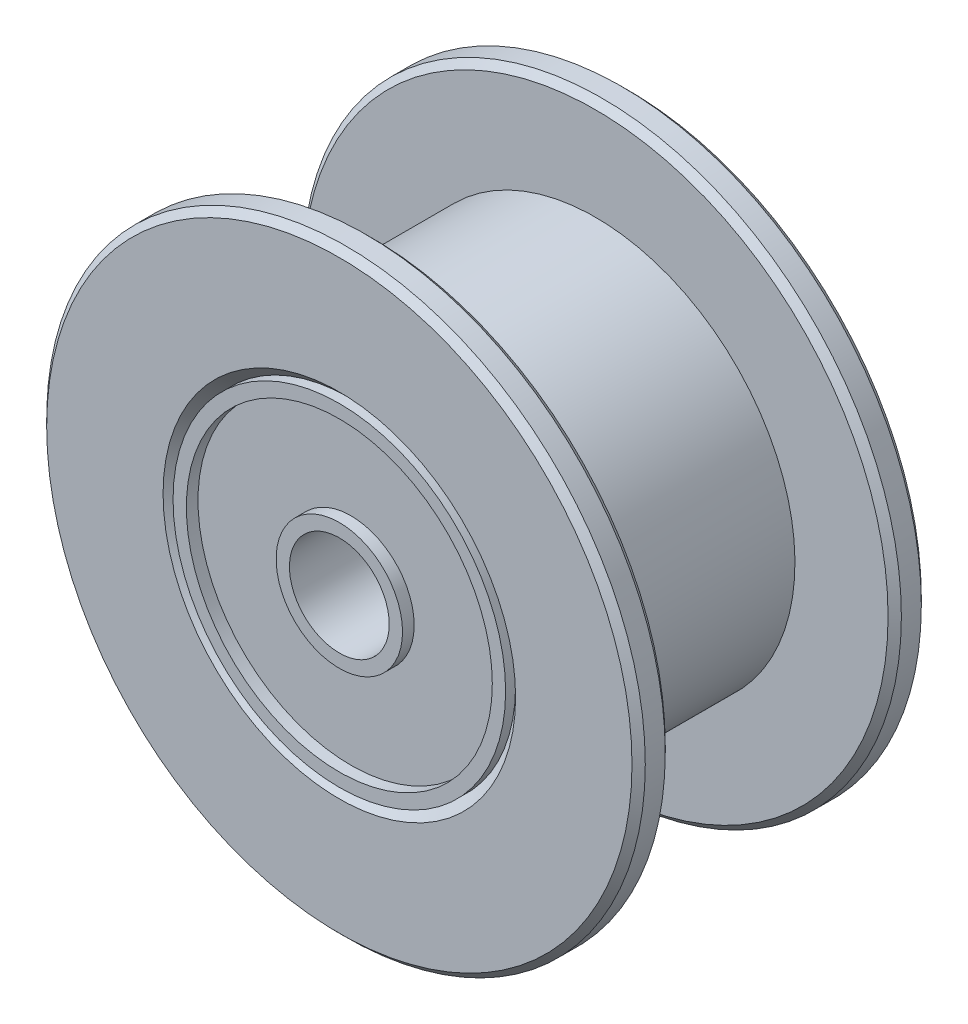
ISO-10303-21;
HEADER;
FILE_DESCRIPTION(('STEP AP214'),'2;1');
FILE_NAME('part.step','',(''),(''),'','','');
FILE_SCHEMA(('AUTOMOTIVE_DESIGN { 1 0 10303 214 1 1 1 1 }'));
ENDSEC;
DATA;
#1=APPLICATION_CONTEXT('core data for automotive mechanical design processes');
#2=APPLICATION_PROTOCOL_DEFINITION('international standard','automotive_design',2000,#1);
#3=PRODUCT_CONTEXT('',#1,'mechanical');
#4=PRODUCT('Part','Part','',(#3));
#5=PRODUCT_RELATED_PRODUCT_CATEGORY('part','',(#4));
#6=PRODUCT_DEFINITION_FORMATION('','',#4);
#7=PRODUCT_DEFINITION_CONTEXT('part definition',#1,'design');
#8=PRODUCT_DEFINITION('design','',#6,#7);
#9=PRODUCT_DEFINITION_SHAPE('','',#8);
#10=(LENGTH_UNIT() NAMED_UNIT(*) SI_UNIT(.MILLI.,.METRE.));
#11=(NAMED_UNIT(*) PLANE_ANGLE_UNIT() SI_UNIT($,.RADIAN.));
#12=(NAMED_UNIT(*) SI_UNIT($,.STERADIAN.) SOLID_ANGLE_UNIT());
#13=UNCERTAINTY_MEASURE_WITH_UNIT(LENGTH_MEASURE(1.E-05),#10,'distance_accuracy_value','');
#14=(GEOMETRIC_REPRESENTATION_CONTEXT(3) GLOBAL_UNCERTAINTY_ASSIGNED_CONTEXT((#13)) GLOBAL_UNIT_ASSIGNED_CONTEXT((#10,
#11,#12)) REPRESENTATION_CONTEXT('',''));
#15=CARTESIAN_POINT('',(0.,0.,0.));
#16=DIRECTION('',(0.,0.,1.));
#17=DIRECTION('',(1.,0.,0.));
#18=AXIS2_PLACEMENT_3D('',#15,#16,#17);
#19=CARTESIAN_POINT('',(0.,0.,4.2));
#20=DIRECTION('',(0.,0.,1.));
#21=DIRECTION('',(-1.,0.,0.));
#22=AXIS2_PLACEMENT_3D('',#19,#20,#21);
#23=CONICAL_SURFACE('',#22,5.15,0.785398163397449);
#24=CARTESIAN_POINT('',(0.,0.,4.35));
#25=DIRECTION('',(0.,0.,1.));
#26=DIRECTION('',(-1.,0.,0.));
#27=AXIS2_PLACEMENT_3D('',#24,#25,#26);
#28=CIRCLE('',#27,5.3);
#29=CARTESIAN_POINT('',(5.3,0.,4.35));
#30=VERTEX_POINT('',#29);
#31=EDGE_CURVE('E155',#30,#30,#28,.T.);
#32=ORIENTED_EDGE('',*,*,#31,.T.);
#33=EDGE_LOOP('',(#32));
#34=FACE_BOUND('',#33,.T.);
#35=CARTESIAN_POINT('',(0.,0.,4.05));
#36=DIRECTION('',(0.,0.,-1.));
#37=DIRECTION('',(-1.,0.,0.));
#38=AXIS2_PLACEMENT_3D('',#35,#36,#37);
#39=CIRCLE('',#38,5.);
#40=CARTESIAN_POINT('',(5.,0.,4.05));
#41=VERTEX_POINT('',#40);
#42=EDGE_CURVE('E126',#41,#41,#39,.T.);
#43=ORIENTED_EDGE('',*,*,#42,.T.);
#44=EDGE_LOOP('',(#43));
#45=FACE_BOUND('',#44,.T.);
#46=ADVANCED_FACE('F16',(#34,#45),#23,.F.);
#47=CARTESIAN_POINT('',(0.,0.,-4.2));
#48=DIRECTION('',(0.,0.,-1.));
#49=DIRECTION('',(-1.,0.,0.));
#50=AXIS2_PLACEMENT_3D('',#47,#48,#49);
#51=CONICAL_SURFACE('',#50,5.15,0.785398163397449);
#52=CARTESIAN_POINT('',(0.,0.,-4.35));
#53=DIRECTION('',(0.,0.,-1.));
#54=DIRECTION('',(-1.,0.,0.));
#55=AXIS2_PLACEMENT_3D('',#52,#53,#54);
#56=CIRCLE('',#55,5.3);
#57=CARTESIAN_POINT('',(5.3,0.,-4.35));
#58=VERTEX_POINT('',#57);
#59=EDGE_CURVE('E146',#58,#58,#56,.T.);
#60=ORIENTED_EDGE('',*,*,#59,.T.);
#61=EDGE_LOOP('',(#60));
#62=FACE_BOUND('',#61,.T.);
#63=CARTESIAN_POINT('',(0.,0.,-4.05));
#64=DIRECTION('',(0.,0.,1.));
#65=DIRECTION('',(-1.,0.,0.));
#66=AXIS2_PLACEMENT_3D('',#63,#64,#65);
#67=CIRCLE('',#66,5.);
#68=CARTESIAN_POINT('',(5.,0.,-4.05));
#69=VERTEX_POINT('',#68);
#70=EDGE_CURVE('E26',#69,#69,#67,.T.);
#71=ORIENTED_EDGE('',*,*,#70,.T.);
#72=EDGE_LOOP('',(#71));
#73=FACE_BOUND('',#72,.T.);
#74=ADVANCED_FACE('F189',(#62,#73),#51,.F.);
#75=CARTESIAN_POINT('',(0.,0.,4.35));
#76=DIRECTION('',(0.,0.,1.));
#77=DIRECTION('',(1.,0.,0.));
#78=AXIS2_PLACEMENT_3D('',#75,#76,#77);
#79=PLANE('',#78);
#80=CARTESIAN_POINT('',(0.,0.,4.35));
#81=DIRECTION('',(0.,0.,1.));
#82=DIRECTION('',(-1.,0.,0.));
#83=AXIS2_PLACEMENT_3D('',#80,#81,#82);
#84=CIRCLE('',#83,5.);
#85=CARTESIAN_POINT('',(5.,0.,4.35));
#86=VERTEX_POINT('',#85);
#87=EDGE_CURVE('E134',#86,#86,#84,.T.);
#88=ORIENTED_EDGE('',*,*,#87,.T.);
#89=EDGE_LOOP('',(#88));
#90=FACE_BOUND('',#89,.T.);
#91=CARTESIAN_POINT('',(0.,0.,4.35));
#92=DIRECTION('',(0.,0.,-1.));
#93=DIRECTION('',(-1.,0.,0.));
#94=AXIS2_PLACEMENT_3D('',#91,#92,#93);
#95=CIRCLE('',#94,4.6);
#96=CARTESIAN_POINT('',(4.6,0.,4.35));
#97=VERTEX_POINT('',#96);
#98=EDGE_CURVE('E20',#97,#97,#95,.T.);
#99=ORIENTED_EDGE('',*,*,#98,.T.);
#100=EDGE_LOOP('',(#99));
#101=FACE_BOUND('',#100,.T.);
#102=ADVANCED_FACE('F194',(#90,#101),#79,.T.);
#103=CARTESIAN_POINT('',(0.,0.,-4.35));
#104=DIRECTION('',(0.,0.,1.));
#105=DIRECTION('',(1.,0.,0.));
#106=AXIS2_PLACEMENT_3D('',#103,#104,#105);
#107=PLANE('',#106);
#108=CARTESIAN_POINT('',(0.,0.,-4.35));
#109=DIRECTION('',(0.,0.,-1.));
#110=DIRECTION('',(-1.,0.,0.));
#111=AXIS2_PLACEMENT_3D('',#108,#109,#110);
#112=CIRCLE('',#111,5.);
#113=CARTESIAN_POINT('',(5.,0.,-4.35));
#114=VERTEX_POINT('',#113);
#115=EDGE_CURVE('E124',#114,#114,#112,.T.);
#116=ORIENTED_EDGE('',*,*,#115,.T.);
#117=EDGE_LOOP('',(#116));
#118=FACE_BOUND('',#117,.T.);
#119=CARTESIAN_POINT('',(0.,0.,-4.35));
#120=DIRECTION('',(0.,0.,1.));
#121=DIRECTION('',(-1.,0.,0.));
#122=AXIS2_PLACEMENT_3D('',#119,#120,#121);
#123=CIRCLE('',#122,4.6);
#124=CARTESIAN_POINT('',(4.6,0.,-4.35));
#125=VERTEX_POINT('',#124);
#126=EDGE_CURVE('E11',#125,#125,#123,.T.);
#127=ORIENTED_EDGE('',*,*,#126,.T.);
#128=EDGE_LOOP('',(#127));
#129=FACE_BOUND('',#128,.T.);
#130=ADVANCED_FACE('F237',(#118,#129),#107,.F.);
#131=CARTESIAN_POINT('',(0.,0.,0.));
#132=DIRECTION('',(0.,0.,-1.));
#133=DIRECTION('',(-1.,0.,0.));
#134=AXIS2_PLACEMENT_3D('',#131,#132,#133);
#135=CYLINDRICAL_SURFACE('',#134,4.6);
#136=ORIENTED_EDGE('',*,*,#126,.F.);
#137=EDGE_LOOP('',(#136));
#138=FACE_BOUND('',#137,.T.);
#139=CARTESIAN_POINT('',(0.,0.,-4.));
#140=DIRECTION('',(0.,0.,1.));
#141=DIRECTION('',(-1.,0.,0.));
#142=AXIS2_PLACEMENT_3D('',#139,#140,#141);
#143=CIRCLE('',#142,4.6);
#144=CARTESIAN_POINT('',(4.6,0.,-4.));
#145=VERTEX_POINT('',#144);
#146=EDGE_CURVE('E112',#145,#145,#143,.T.);
#147=ORIENTED_EDGE('',*,*,#146,.T.);
#148=EDGE_LOOP('',(#147));
#149=FACE_BOUND('',#148,.T.);
#150=ADVANCED_FACE('F232',(#138,#149),#135,.F.);
#151=CARTESIAN_POINT('',(0.,0.,0.));
#152=DIRECTION('',(0.,0.,-1.));
#153=DIRECTION('',(-1.,0.,0.));
#154=AXIS2_PLACEMENT_3D('',#151,#152,#153);
#155=CYLINDRICAL_SURFACE('',#154,5.);
#156=ORIENTED_EDGE('',*,*,#70,.F.);
#157=EDGE_LOOP('',(#156));
#158=FACE_BOUND('',#157,.T.);
#159=ORIENTED_EDGE('',*,*,#115,.F.);
#160=EDGE_LOOP('',(#159));
#161=FACE_BOUND('',#160,.T.);
#162=ADVANCED_FACE('F228',(#158,#161),#155,.T.);
#163=CARTESIAN_POINT('',(0.,0.,0.));
#164=DIRECTION('',(0.,0.,-1.));
#165=DIRECTION('',(-1.,0.,0.));
#166=AXIS2_PLACEMENT_3D('',#163,#164,#165);
#167=CYLINDRICAL_SURFACE('',#166,5.);
#168=ORIENTED_EDGE('',*,*,#42,.F.);
#169=EDGE_LOOP('',(#168));
#170=FACE_BOUND('',#169,.T.);
#171=ORIENTED_EDGE('',*,*,#87,.F.);
#172=EDGE_LOOP('',(#171));
#173=FACE_BOUND('',#172,.T.);
#174=ADVANCED_FACE('F231',(#170,#173),#167,.T.);
#175=CARTESIAN_POINT('',(0.,0.,0.));
#176=DIRECTION('',(0.,0.,-1.));
#177=DIRECTION('',(-1.,0.,0.));
#178=AXIS2_PLACEMENT_3D('',#175,#176,#177);
#179=CYLINDRICAL_SURFACE('',#178,4.6);
#180=CARTESIAN_POINT('',(0.,0.,4.));
#181=DIRECTION('',(0.,0.,-1.));
#182=DIRECTION('',(-1.,0.,0.));
#183=AXIS2_PLACEMENT_3D('',#180,#181,#182);
#184=CIRCLE('',#183,4.6);
#185=CARTESIAN_POINT('',(4.6,0.,4.));
#186=VERTEX_POINT('',#185);
#187=EDGE_CURVE('E104',#186,#186,#184,.T.);
#188=ORIENTED_EDGE('',*,*,#187,.T.);
#189=EDGE_LOOP('',(#188));
#190=FACE_BOUND('',#189,.T.);
#191=ORIENTED_EDGE('',*,*,#98,.F.);
#192=EDGE_LOOP('',(#191));
#193=FACE_BOUND('',#192,.T.);
#194=ADVANCED_FACE('F245',(#190,#193),#179,.F.);
#195=CARTESIAN_POINT('',(0.,0.,4.35));
#196=DIRECTION('',(0.,0.,1.));
#197=DIRECTION('',(1.,0.,0.));
#198=AXIS2_PLACEMENT_3D('',#195,#196,#197);
#199=PLANE('',#198);
#200=CARTESIAN_POINT('',(0.,0.,4.35));
#201=DIRECTION('',(0.,0.,1.));
#202=DIRECTION('',(-1.,0.,0.));
#203=AXIS2_PLACEMENT_3D('',#200,#201,#202);
#204=CIRCLE('',#203,1.9);
#205=CARTESIAN_POINT('',(1.9,0.,4.35));
#206=VERTEX_POINT('',#205);
#207=EDGE_CURVE('E114',#206,#206,#204,.T.);
#208=ORIENTED_EDGE('',*,*,#207,.T.);
#209=EDGE_LOOP('',(#208));
#210=FACE_BOUND('',#209,.T.);
#211=CARTESIAN_POINT('',(0.,0.,4.35));
#212=DIRECTION('',(0.,0.,-1.));
#213=DIRECTION('',(-1.,0.,0.));
#214=AXIS2_PLACEMENT_3D('',#211,#212,#213);
#215=CIRCLE('',#214,1.5);
#216=CARTESIAN_POINT('',(1.5,0.,4.35));
#217=VERTEX_POINT('',#216);
#218=EDGE_CURVE('E123',#217,#217,#215,.T.);
#219=ORIENTED_EDGE('',*,*,#218,.T.);
#220=EDGE_LOOP('',(#219));
#221=FACE_BOUND('',#220,.T.);
#222=ADVANCED_FACE('F203',(#210,#221),#199,.T.);
#223=CARTESIAN_POINT('',(0.,0.,0.));
#224=DIRECTION('',(0.,0.,-1.));
#225=DIRECTION('',(-1.,0.,0.));
#226=AXIS2_PLACEMENT_3D('',#223,#224,#225);
#227=CYLINDRICAL_SURFACE('',#226,1.9);
#228=CARTESIAN_POINT('',(0.,0.,-4.35));
#229=DIRECTION('',(0.,0.,-1.));
#230=DIRECTION('',(-1.,0.,0.));
#231=AXIS2_PLACEMENT_3D('',#228,#229,#230);
#232=CIRCLE('',#231,1.9);
#233=CARTESIAN_POINT('',(1.9,0.,-4.35));
#234=VERTEX_POINT('',#233);
#235=EDGE_CURVE('E159',#234,#234,#232,.T.);
#236=ORIENTED_EDGE('',*,*,#235,.F.);
#237=EDGE_LOOP('',(#236));
#238=FACE_BOUND('',#237,.T.);
#239=CARTESIAN_POINT('',(0.,0.,-4.));
#240=DIRECTION('',(0.,0.,-1.));
#241=DIRECTION('',(-1.,0.,0.));
#242=AXIS2_PLACEMENT_3D('',#239,#240,#241);
#243=CIRCLE('',#242,1.9);
#244=CARTESIAN_POINT('',(1.9,0.,-4.));
#245=VERTEX_POINT('',#244);
#246=EDGE_CURVE('E116',#245,#245,#243,.T.);
#247=ORIENTED_EDGE('',*,*,#246,.T.);
#248=EDGE_LOOP('',(#247));
#249=FACE_BOUND('',#248,.T.);
#250=ADVANCED_FACE('F200',(#238,#249),#227,.T.);
#251=CARTESIAN_POINT('',(0.,0.,-4.35));
#252=DIRECTION('',(0.,0.,1.));
#253=DIRECTION('',(1.,0.,0.));
#254=AXIS2_PLACEMENT_3D('',#251,#252,#253);
#255=PLANE('',#254);
#256=ORIENTED_EDGE('',*,*,#235,.T.);
#257=EDGE_LOOP('',(#256));
#258=FACE_BOUND('',#257,.T.);
#259=CARTESIAN_POINT('',(0.,0.,-4.35));
#260=DIRECTION('',(0.,0.,1.));
#261=DIRECTION('',(-1.,0.,0.));
#262=AXIS2_PLACEMENT_3D('',#259,#260,#261);
#263=CIRCLE('',#262,1.5);
#264=CARTESIAN_POINT('',(1.5,0.,-4.35));
#265=VERTEX_POINT('',#264);
#266=EDGE_CURVE('E122',#265,#265,#263,.T.);
#267=ORIENTED_EDGE('',*,*,#266,.T.);
#268=EDGE_LOOP('',(#267));
#269=FACE_BOUND('',#268,.T.);
#270=ADVANCED_FACE('F202',(#258,#269),#255,.F.);
#271=CARTESIAN_POINT('',(0.,0.,0.));
#272=DIRECTION('',(0.,0.,-1.));
#273=DIRECTION('',(-1.,0.,0.));
#274=AXIS2_PLACEMENT_3D('',#271,#272,#273);
#275=CYLINDRICAL_SURFACE('',#274,1.5);
#276=ORIENTED_EDGE('',*,*,#218,.F.);
#277=EDGE_LOOP('',(#276));
#278=FACE_BOUND('',#277,.T.);
#279=ORIENTED_EDGE('',*,*,#266,.F.);
#280=EDGE_LOOP('',(#279));
#281=FACE_BOUND('',#280,.T.);
#282=ADVANCED_FACE('F209',(#278,#281),#275,.F.);
#283=CARTESIAN_POINT('',(0.,0.,0.));
#284=DIRECTION('',(0.,0.,-1.));
#285=DIRECTION('',(-1.,0.,0.));
#286=AXIS2_PLACEMENT_3D('',#283,#284,#285);
#287=CYLINDRICAL_SURFACE('',#286,1.9);
#288=CARTESIAN_POINT('',(0.,0.,4.));
#289=DIRECTION('',(0.,0.,1.));
#290=DIRECTION('',(-1.,0.,0.));
#291=AXIS2_PLACEMENT_3D('',#288,#289,#290);
#292=CIRCLE('',#291,1.9);
#293=CARTESIAN_POINT('',(1.9,0.,4.));
#294=VERTEX_POINT('',#293);
#295=EDGE_CURVE('E108',#294,#294,#292,.T.);
#296=ORIENTED_EDGE('',*,*,#295,.T.);
#297=EDGE_LOOP('',(#296));
#298=FACE_BOUND('',#297,.T.);
#299=ORIENTED_EDGE('',*,*,#207,.F.);
#300=EDGE_LOOP('',(#299));
#301=FACE_BOUND('',#300,.T.);
#302=ADVANCED_FACE('F109',(#298,#301),#287,.T.);
#303=CARTESIAN_POINT('',(0.,0.,4.));
#304=DIRECTION('',(0.,0.,1.));
#305=DIRECTION('',(1.,0.,0.));
#306=AXIS2_PLACEMENT_3D('',#303,#304,#305);
#307=PLANE('',#306);
#308=ORIENTED_EDGE('',*,*,#187,.F.);
#309=EDGE_LOOP('',(#308));
#310=FACE_BOUND('',#309,.T.);
#311=ORIENTED_EDGE('',*,*,#295,.F.);
#312=EDGE_LOOP('',(#311));
#313=FACE_BOUND('',#312,.T.);
#314=ADVANCED_FACE('F184',(#310,#313),#307,.T.);
#315=CARTESIAN_POINT('',(0.,0.,-4.));
#316=DIRECTION('',(0.,0.,1.));
#317=DIRECTION('',(1.,0.,0.));
#318=AXIS2_PLACEMENT_3D('',#315,#316,#317);
#319=PLANE('',#318);
#320=ORIENTED_EDGE('',*,*,#146,.F.);
#321=EDGE_LOOP('',(#320));
#322=FACE_BOUND('',#321,.T.);
#323=ORIENTED_EDGE('',*,*,#246,.F.);
#324=EDGE_LOOP('',(#323));
#325=FACE_BOUND('',#324,.T.);
#326=ADVANCED_FACE('F175',(#322,#325),#319,.F.);
#327=CARTESIAN_POINT('',(0.,0.,4.35));
#328=DIRECTION('',(0.,0.,1.));
#329=DIRECTION('',(1.,0.,0.));
#330=AXIS2_PLACEMENT_3D('',#327,#328,#329);
#331=PLANE('',#330);
#332=CARTESIAN_POINT('',(0.,0.,4.35));
#333=DIRECTION('',(0.,0.,-1.));
#334=DIRECTION('',(-1.,0.,0.));
#335=AXIS2_PLACEMENT_3D('',#332,#333,#334);
#336=CIRCLE('',#335,8.8);
#337=CARTESIAN_POINT('',(8.8,0.,4.35));
#338=VERTEX_POINT('',#337);
#339=EDGE_CURVE('E120',#338,#338,#336,.T.);
#340=ORIENTED_EDGE('',*,*,#339,.F.);
#341=EDGE_LOOP('',(#340));
#342=FACE_BOUND('',#341,.T.);
#343=ORIENTED_EDGE('',*,*,#31,.F.);
#344=EDGE_LOOP('',(#343));
#345=FACE_BOUND('',#344,.T.);
#346=ADVANCED_FACE('F172',(#342,#345),#331,.T.);
#347=CARTESIAN_POINT('',(0.,0.,4.25));
#348=DIRECTION('',(0.,0.,-1.));
#349=DIRECTION('',(-1.,0.,0.));
#350=AXIS2_PLACEMENT_3D('',#347,#348,#349);
#351=CONICAL_SURFACE('',#350,8.9,0.785398163397448);
#352=ORIENTED_EDGE('',*,*,#339,.T.);
#353=EDGE_LOOP('',(#352));
#354=FACE_BOUND('',#353,.T.);
#355=CARTESIAN_POINT('',(0.,0.,4.15));
#356=DIRECTION('',(0.,0.,1.));
#357=DIRECTION('',(-1.,0.,0.));
#358=AXIS2_PLACEMENT_3D('',#355,#356,#357);
#359=CIRCLE('',#358,9.);
#360=CARTESIAN_POINT('',(9.,0.,4.15));
#361=VERTEX_POINT('',#360);
#362=EDGE_CURVE('E150',#361,#361,#359,.T.);
#363=ORIENTED_EDGE('',*,*,#362,.T.);
#364=EDGE_LOOP('',(#363));
#365=FACE_BOUND('',#364,.T.);
#366=ADVANCED_FACE('F169',(#354,#365),#351,.T.);
#367=CARTESIAN_POINT('',(0.,0.,0.));
#368=DIRECTION('',(0.,0.,-1.));
#369=DIRECTION('',(-1.,0.,0.));
#370=AXIS2_PLACEMENT_3D('',#367,#368,#369);
#371=CYLINDRICAL_SURFACE('',#370,9.);
#372=CARTESIAN_POINT('',(0.,0.,3.55));
#373=DIRECTION('',(0.,0.,-1.));
#374=DIRECTION('',(-1.,0.,0.));
#375=AXIS2_PLACEMENT_3D('',#372,#373,#374);
#376=CIRCLE('',#375,9.);
#377=CARTESIAN_POINT('',(9.,0.,3.55));
#378=VERTEX_POINT('',#377);
#379=EDGE_CURVE('E152',#378,#378,#376,.T.);
#380=ORIENTED_EDGE('',*,*,#379,.F.);
#381=EDGE_LOOP('',(#380));
#382=FACE_BOUND('',#381,.T.);
#383=ORIENTED_EDGE('',*,*,#362,.F.);
#384=EDGE_LOOP('',(#383));
#385=FACE_BOUND('',#384,.T.);
#386=ADVANCED_FACE('F182',(#382,#385),#371,.T.);
#387=CARTESIAN_POINT('',(0.,0.,3.45));
#388=DIRECTION('',(0.,0.,1.));
#389=DIRECTION('',(-1.,0.,0.));
#390=AXIS2_PLACEMENT_3D('',#387,#388,#389);
#391=CONICAL_SURFACE('',#390,8.9,0.785398163397448);
#392=ORIENTED_EDGE('',*,*,#379,.T.);
#393=EDGE_LOOP('',(#392));
#394=FACE_BOUND('',#393,.T.);
#395=CARTESIAN_POINT('',(0.,0.,3.35));
#396=DIRECTION('',(0.,0.,1.));
#397=DIRECTION('',(-1.,0.,0.));
#398=AXIS2_PLACEMENT_3D('',#395,#396,#397);
#399=CIRCLE('',#398,8.8);
#400=CARTESIAN_POINT('',(8.8,0.,3.35));
#401=VERTEX_POINT('',#400);
#402=EDGE_CURVE('E147',#401,#401,#399,.T.);
#403=ORIENTED_EDGE('',*,*,#402,.T.);
#404=EDGE_LOOP('',(#403));
#405=FACE_BOUND('',#404,.T.);
#406=ADVANCED_FACE('F220',(#394,#405),#391,.T.);
#407=CARTESIAN_POINT('',(0.,0.,-3.35));
#408=DIRECTION('',(0.,0.,1.));
#409=DIRECTION('',(1.,0.,0.));
#410=AXIS2_PLACEMENT_3D('',#407,#408,#409);
#411=PLANE('',#410);
#412=CARTESIAN_POINT('',(0.,0.,-3.35));
#413=DIRECTION('',(0.,0.,-1.));
#414=DIRECTION('',(-1.,0.,0.));
#415=AXIS2_PLACEMENT_3D('',#412,#413,#414);
#416=CIRCLE('',#415,8.8);
#417=CARTESIAN_POINT('',(8.8,0.,-3.35));
#418=VERTEX_POINT('',#417);
#419=EDGE_CURVE('E154',#418,#418,#416,.T.);
#420=ORIENTED_EDGE('',*,*,#419,.F.);
#421=EDGE_LOOP('',(#420));
#422=FACE_BOUND('',#421,.T.);
#423=CARTESIAN_POINT('',(0.,0.,-3.35));
#424=DIRECTION('',(0.,0.,-1.));
#425=DIRECTION('',(1.,0.,0.));
#426=AXIS2_PLACEMENT_3D('',#423,#424,#425);
#427=CIRCLE('',#426,6.);
#428=CARTESIAN_POINT('',(-0.552558553039482,-5.97450240986335,-3.35));
#429=VERTEX_POINT('',#428);
#430=EDGE_CURVE('E157',#429,#429,#427,.T.);
#431=ORIENTED_EDGE('',*,*,#430,.T.);
#432=EDGE_LOOP('',(#431));
#433=FACE_BOUND('',#432,.T.);
#434=ADVANCED_FACE('F216',(#422,#433),#411,.T.);
#435=CARTESIAN_POINT('',(0.,0.,-3.45));
#436=DIRECTION('',(0.,0.,-1.));
#437=DIRECTION('',(-1.,0.,0.));
#438=AXIS2_PLACEMENT_3D('',#435,#436,#437);
#439=CONICAL_SURFACE('',#438,8.9,0.785398163397448);
#440=CARTESIAN_POINT('',(0.,0.,-3.55));
#441=DIRECTION('',(0.,0.,1.));
#442=DIRECTION('',(-1.,0.,0.));
#443=AXIS2_PLACEMENT_3D('',#440,#441,#442);
#444=CIRCLE('',#443,9.);
#445=CARTESIAN_POINT('',(9.,0.,-3.55));
#446=VERTEX_POINT('',#445);
#447=EDGE_CURVE('E142',#446,#446,#444,.T.);
#448=ORIENTED_EDGE('',*,*,#447,.T.);
#449=EDGE_LOOP('',(#448));
#450=FACE_BOUND('',#449,.T.);
#451=ORIENTED_EDGE('',*,*,#419,.T.);
#452=EDGE_LOOP('',(#451));
#453=FACE_BOUND('',#452,.T.);
#454=ADVANCED_FACE('F219',(#450,#453),#439,.T.);
#455=CARTESIAN_POINT('',(0.,0.,-4.35));
#456=DIRECTION('',(0.,0.,1.));
#457=DIRECTION('',(1.,0.,0.));
#458=AXIS2_PLACEMENT_3D('',#455,#456,#457);
#459=PLANE('',#458);
#460=CARTESIAN_POINT('',(0.,0.,-4.35));
#461=DIRECTION('',(0.,0.,1.));
#462=DIRECTION('',(-1.,0.,0.));
#463=AXIS2_PLACEMENT_3D('',#460,#461,#462);
#464=CIRCLE('',#463,8.8);
#465=CARTESIAN_POINT('',(8.8,0.,-4.35));
#466=VERTEX_POINT('',#465);
#467=EDGE_CURVE('E141',#466,#466,#464,.T.);
#468=ORIENTED_EDGE('',*,*,#467,.F.);
#469=EDGE_LOOP('',(#468));
#470=FACE_BOUND('',#469,.T.);
#471=ORIENTED_EDGE('',*,*,#59,.F.);
#472=EDGE_LOOP('',(#471));
#473=FACE_BOUND('',#472,.T.);
#474=ADVANCED_FACE('F18',(#470,#473),#459,.F.);
#475=CARTESIAN_POINT('',(0.,0.,0.));
#476=DIRECTION('',(0.,0.,-1.));
#477=DIRECTION('',(-1.,0.,0.));
#478=AXIS2_PLACEMENT_3D('',#475,#476,#477);
#479=CYLINDRICAL_SURFACE('',#478,9.);
#480=CARTESIAN_POINT('',(0.,0.,-4.15));
#481=DIRECTION('',(0.,0.,-1.));
#482=DIRECTION('',(-1.,0.,0.));
#483=AXIS2_PLACEMENT_3D('',#480,#481,#482);
#484=CIRCLE('',#483,9.);
#485=CARTESIAN_POINT('',(9.,0.,-4.15));
#486=VERTEX_POINT('',#485);
#487=EDGE_CURVE('E143',#486,#486,#484,.T.);
#488=ORIENTED_EDGE('',*,*,#487,.F.);
#489=EDGE_LOOP('',(#488));
#490=FACE_BOUND('',#489,.T.);
#491=ORIENTED_EDGE('',*,*,#447,.F.);
#492=EDGE_LOOP('',(#491));
#493=FACE_BOUND('',#492,.T.);
#494=ADVANCED_FACE('F226',(#490,#493),#479,.T.);
#495=CARTESIAN_POINT('',(0.,0.,-4.25));
#496=DIRECTION('',(0.,0.,1.));
#497=DIRECTION('',(-1.,0.,0.));
#498=AXIS2_PLACEMENT_3D('',#495,#496,#497);
#499=CONICAL_SURFACE('',#498,8.9,0.785398163397448);
#500=ORIENTED_EDGE('',*,*,#467,.T.);
#501=EDGE_LOOP('',(#500));
#502=FACE_BOUND('',#501,.T.);
#503=ORIENTED_EDGE('',*,*,#487,.T.);
#504=EDGE_LOOP('',(#503));
#505=FACE_BOUND('',#504,.T.);
#506=ADVANCED_FACE('F222',(#502,#505),#499,.T.);
#507=CARTESIAN_POINT('',(0.,0.,3.35));
#508=DIRECTION('',(0.,0.,1.));
#509=DIRECTION('',(1.,0.,0.));
#510=AXIS2_PLACEMENT_3D('',#507,#508,#509);
#511=CYLINDRICAL_SURFACE('',#510,6.);
#512=ORIENTED_EDGE('',*,*,#430,.F.);
#513=EDGE_LOOP('',(#512));
#514=FACE_BOUND('',#513,.T.);
#515=CARTESIAN_POINT('',(0.,0.,3.35));
#516=DIRECTION('',(0.,0.,1.));
#517=DIRECTION('',(1.,0.,0.));
#518=AXIS2_PLACEMENT_3D('',#515,#516,#517);
#519=CIRCLE('',#518,6.);
#520=CARTESIAN_POINT('',(-0.552558553039482,-5.97450240986335,3.35));
#521=VERTEX_POINT('',#520);
#522=EDGE_CURVE('E149',#521,#521,#519,.T.);
#523=ORIENTED_EDGE('',*,*,#522,.F.);
#524=EDGE_LOOP('',(#523));
#525=FACE_BOUND('',#524,.T.);
#526=ADVANCED_FACE('F225',(#514,#525),#511,.T.);
#527=CARTESIAN_POINT('',(0.,0.,3.35));
#528=DIRECTION('',(0.,0.,1.));
#529=DIRECTION('',(1.,0.,0.));
#530=AXIS2_PLACEMENT_3D('',#527,#528,#529);
#531=PLANE('',#530);
#532=ORIENTED_EDGE('',*,*,#522,.T.);
#533=EDGE_LOOP('',(#532));
#534=FACE_BOUND('',#533,.T.);
#535=ORIENTED_EDGE('',*,*,#402,.F.);
#536=EDGE_LOOP('',(#535));
#537=FACE_BOUND('',#536,.T.);
#538=ADVANCED_FACE('F250',(#534,#537),#531,.F.);
#539=CLOSED_SHELL('',(#46,#74,#102,#130,#150,#162,#174,#194,#222,#250,#270,#282,#302,#314,#326,
#346,#366,#386,#406,#434,#454,#474,#494,#506,#526,#538));
#540=MANIFOLD_SOLID_BREP('B1',#539);
#541=ADVANCED_BREP_SHAPE_REPRESENTATION('',(#18,#540),#14);
#542=SHAPE_DEFINITION_REPRESENTATION(#9,#541);
ENDSEC;
END-ISO-10303-21;
